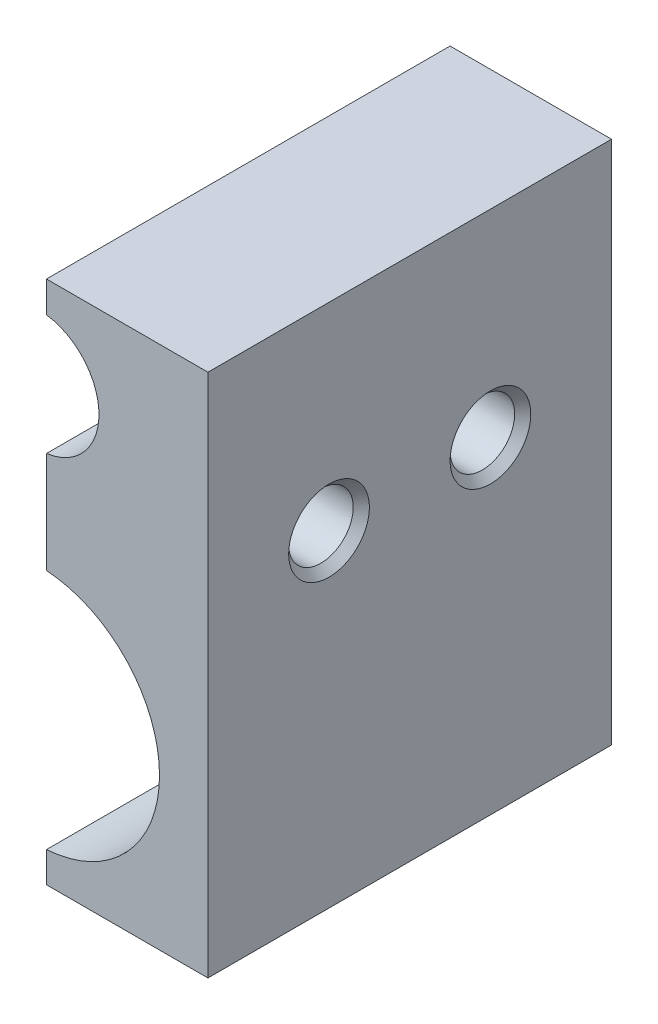
ISO-10303-21;
HEADER;
FILE_DESCRIPTION(('STEP AP214'),'2;1');
FILE_NAME('part.step','',(''),(''),'','','');
FILE_SCHEMA(('AUTOMOTIVE_DESIGN { 1 0 10303 214 1 1 1 1 }'));
ENDSEC;
DATA;
#1=APPLICATION_CONTEXT('core data for automotive mechanical design processes');
#2=APPLICATION_PROTOCOL_DEFINITION('international standard','automotive_design',2000,#1);
#3=PRODUCT_CONTEXT('',#1,'mechanical');
#4=PRODUCT('Part','Part','',(#3));
#5=PRODUCT_RELATED_PRODUCT_CATEGORY('part','',(#4));
#6=PRODUCT_DEFINITION_FORMATION('','',#4);
#7=PRODUCT_DEFINITION_CONTEXT('part definition',#1,'design');
#8=PRODUCT_DEFINITION('design','',#6,#7);
#9=PRODUCT_DEFINITION_SHAPE('','',#8);
#10=(LENGTH_UNIT() NAMED_UNIT(*) SI_UNIT(.MILLI.,.METRE.));
#11=(NAMED_UNIT(*) PLANE_ANGLE_UNIT() SI_UNIT($,.RADIAN.));
#12=(NAMED_UNIT(*) SI_UNIT($,.STERADIAN.) SOLID_ANGLE_UNIT());
#13=UNCERTAINTY_MEASURE_WITH_UNIT(LENGTH_MEASURE(1.E-05),#10,'distance_accuracy_value','');
#14=(GEOMETRIC_REPRESENTATION_CONTEXT(3) GLOBAL_UNCERTAINTY_ASSIGNED_CONTEXT((#13)) GLOBAL_UNIT_ASSIGNED_CONTEXT((#10,
#11,#12)) REPRESENTATION_CONTEXT('',''));
#15=CARTESIAN_POINT('',(0.,0.,0.));
#16=DIRECTION('',(0.,0.,1.));
#17=DIRECTION('',(1.,0.,0.));
#18=AXIS2_PLACEMENT_3D('',#15,#16,#17);
#19=CARTESIAN_POINT('',(-0.999999999999994,18.7498876397339,50.));
#20=DIRECTION('',(0.,0.,-1.));
#21=DIRECTION('',(-1.,0.,0.));
#22=AXIS2_PLACEMENT_3D('',#19,#20,#21);
#23=CYLINDRICAL_SURFACE('',#22,15.);
#24=CARTESIAN_POINT('',(-0.999999999999994,18.7498876397339,0.));
#25=DIRECTION('',(0.,0.,1.));
#26=DIRECTION('',(1.,0.,0.));
#27=AXIS2_PLACEMENT_3D('',#24,#25,#26);
#28=CIRCLE('',#27,15.);
#29=CARTESIAN_POINT('',(0.,3.78325809263809,0.));
#30=VERTEX_POINT('',#29);
#31=CARTESIAN_POINT('',(0.,33.7165171868296,0.));
#32=VERTEX_POINT('',#31);
#33=EDGE_CURVE('E139',#30,#32,#28,.T.);
#34=ORIENTED_EDGE('',*,*,#33,.F.);
#35=DIRECTION('',(0.,0.,-1.));
#36=VECTOR('',#35,1.);
#37=CARTESIAN_POINT('',(0.,3.78325809263809,50.));
#38=LINE('',#37,#36);
#39=CARTESIAN_POINT('',(0.,3.78325809263809,50.));
#40=VERTEX_POINT('',#39);
#41=EDGE_CURVE('E102',#40,#30,#38,.T.);
#42=ORIENTED_EDGE('',*,*,#41,.F.);
#43=CARTESIAN_POINT('',(-0.999999999999994,18.7498876397339,50.));
#44=DIRECTION('',(0.,0.,1.));
#45=DIRECTION('',(1.,0.,0.));
#46=AXIS2_PLACEMENT_3D('',#43,#44,#45);
#47=CIRCLE('',#46,15.);
#48=CARTESIAN_POINT('',(0.,33.7165171868296,50.));
#49=VERTEX_POINT('',#48);
#50=EDGE_CURVE('E157',#40,#49,#47,.T.);
#51=ORIENTED_EDGE('',*,*,#50,.T.);
#52=DIRECTION('',(0.,0.,-1.));
#53=VECTOR('',#52,1.);
#54=CARTESIAN_POINT('',(0.,33.7165171868296,50.));
#55=LINE('',#54,#53);
#56=EDGE_CURVE('E97',#49,#32,#55,.T.);
#57=ORIENTED_EDGE('',*,*,#56,.T.);
#58=EDGE_LOOP('',(#34,#42,#51,#57));
#59=FACE_BOUND('',#58,.T.);
#60=ADVANCED_FACE('F43',(#59),#23,.F.);
#61=CARTESIAN_POINT('',(0.,0.,50.));
#62=DIRECTION('',(1.,0.,0.));
#63=DIRECTION('',(0.,1.,0.));
#64=AXIS2_PLACEMENT_3D('',#61,#62,#63);
#65=PLANE('',#64);
#66=DIRECTION('',(0.,-1.,0.));
#67=VECTOR('',#66,1.);
#68=CARTESIAN_POINT('',(0.,0.,0.));
#69=LINE('',#68,#67);
#70=CARTESIAN_POINT('',(0.,0.,0.));
#71=VERTEX_POINT('',#70);
#72=EDGE_CURVE('E142',#30,#71,#69,.T.);
#73=ORIENTED_EDGE('',*,*,#72,.T.);
#74=DIRECTION('',(0.,0.,-1.));
#75=VECTOR('',#74,1.);
#76=CARTESIAN_POINT('',(0.,0.,50.));
#77=LINE('',#76,#75);
#78=CARTESIAN_POINT('',(0.,0.,50.));
#79=VERTEX_POINT('',#78);
#80=EDGE_CURVE('E166',#79,#71,#77,.T.);
#81=ORIENTED_EDGE('',*,*,#80,.F.);
#82=DIRECTION('',(0.,-1.,0.));
#83=VECTOR('',#82,1.);
#84=CARTESIAN_POINT('',(0.,0.,50.));
#85=LINE('',#84,#83);
#86=EDGE_CURVE('E201',#40,#79,#85,.T.);
#87=ORIENTED_EDGE('',*,*,#86,.F.);
#88=ORIENTED_EDGE('',*,*,#41,.T.);
#89=EDGE_LOOP('',(#73,#81,#87,#88));
#90=FACE_BOUND('',#89,.T.);
#91=ADVANCED_FACE('F220',(#90),#65,.F.);
#92=CARTESIAN_POINT('',(0.,0.,50.));
#93=DIRECTION('',(0.,1.,0.));
#94=DIRECTION('',(0.,0.,1.));
#95=AXIS2_PLACEMENT_3D('',#92,#93,#94);
#96=PLANE('',#95);
#97=DIRECTION('',(1.,0.,0.));
#98=VECTOR('',#97,1.);
#99=CARTESIAN_POINT('',(0.,0.,0.));
#100=LINE('',#99,#98);
#101=CARTESIAN_POINT('',(20.,0.,0.));
#102=VERTEX_POINT('',#101);
#103=EDGE_CURVE('E145',#71,#102,#100,.T.);
#104=ORIENTED_EDGE('',*,*,#103,.T.);
#105=DIRECTION('',(0.,0.,-1.));
#106=VECTOR('',#105,1.);
#107=CARTESIAN_POINT('',(20.,0.,50.));
#108=LINE('',#107,#106);
#109=CARTESIAN_POINT('',(20.,0.,50.));
#110=VERTEX_POINT('',#109);
#111=EDGE_CURVE('E163',#110,#102,#108,.T.);
#112=ORIENTED_EDGE('',*,*,#111,.F.);
#113=DIRECTION('',(1.,0.,0.));
#114=VECTOR('',#113,1.);
#115=CARTESIAN_POINT('',(0.,0.,50.));
#116=LINE('',#115,#114);
#117=EDGE_CURVE('E203',#79,#110,#116,.T.);
#118=ORIENTED_EDGE('',*,*,#117,.F.);
#119=ORIENTED_EDGE('',*,*,#80,.T.);
#120=EDGE_LOOP('',(#104,#112,#118,#119));
#121=FACE_BOUND('',#120,.T.);
#122=ADVANCED_FACE('F223',(#121),#96,.F.);
#123=CARTESIAN_POINT('',(20.,0.,50.));
#124=DIRECTION('',(-1.,0.,0.));
#125=DIRECTION('',(0.,0.,1.));
#126=AXIS2_PLACEMENT_3D('',#123,#124,#125);
#127=PLANE('',#126);
#128=CARTESIAN_POINT('',(20.,40.5051025721682,15.));
#129=DIRECTION('',(-1.,0.,0.));
#130=DIRECTION('',(0.,0.,1.));
#131=AXIS2_PLACEMENT_3D('',#128,#129,#130);
#132=CIRCLE('',#131,5.00000000000004);
#133=CARTESIAN_POINT('',(20.,40.5051025721682,20.));
#134=VERTEX_POINT('',#133);
#135=EDGE_CURVE('E53',#134,#134,#132,.T.);
#136=ORIENTED_EDGE('',*,*,#135,.T.);
#137=EDGE_LOOP('',(#136));
#138=FACE_BOUND('',#137,.T.);
#139=CARTESIAN_POINT('',(20.,40.5051025721682,35.));
#140=DIRECTION('',(-1.,0.,0.));
#141=DIRECTION('',(0.,0.,1.));
#142=AXIS2_PLACEMENT_3D('',#139,#140,#141);
#143=CIRCLE('',#142,5.00000000000005);
#144=CARTESIAN_POINT('',(20.,40.5051025721682,40.0000000000001));
#145=VERTEX_POINT('',#144);
#146=EDGE_CURVE('E173',#145,#145,#143,.T.);
#147=ORIENTED_EDGE('',*,*,#146,.T.);
#148=EDGE_LOOP('',(#147));
#149=FACE_BOUND('',#148,.T.);
#150=DIRECTION('',(0.,1.,0.));
#151=VECTOR('',#150,1.);
#152=CARTESIAN_POINT('',(20.,0.,0.));
#153=LINE('',#152,#151);
#154=CARTESIAN_POINT('',(20.,65.,0.));
#155=VERTEX_POINT('',#154);
#156=EDGE_CURVE('E147',#102,#155,#153,.T.);
#157=ORIENTED_EDGE('',*,*,#156,.T.);
#158=DIRECTION('',(0.,0.,-1.));
#159=VECTOR('',#158,1.);
#160=CARTESIAN_POINT('',(20.,65.,50.));
#161=LINE('',#160,#159);
#162=CARTESIAN_POINT('',(20.,65.,50.));
#163=VERTEX_POINT('',#162);
#164=EDGE_CURVE('E161',#163,#155,#161,.T.);
#165=ORIENTED_EDGE('',*,*,#164,.F.);
#166=DIRECTION('',(0.,1.,0.));
#167=VECTOR('',#166,1.);
#168=CARTESIAN_POINT('',(20.,0.,50.));
#169=LINE('',#168,#167);
#170=EDGE_CURVE('E205',#110,#163,#169,.T.);
#171=ORIENTED_EDGE('',*,*,#170,.F.);
#172=ORIENTED_EDGE('',*,*,#111,.T.);
#173=EDGE_LOOP('',(#157,#165,#171,#172));
#174=FACE_BOUND('',#173,.T.);
#175=ADVANCED_FACE('F178',(#138,#149,#174),#127,.F.);
#176=CARTESIAN_POINT('',(0.,65.,50.));
#177=DIRECTION('',(0.,1.,0.));
#178=DIRECTION('',(0.,0.,1.));
#179=AXIS2_PLACEMENT_3D('',#176,#177,#178);
#180=PLANE('',#179);
#181=DIRECTION('',(1.,0.,0.));
#182=VECTOR('',#181,1.);
#183=CARTESIAN_POINT('',(0.,65.,0.));
#184=LINE('',#183,#182);
#185=CARTESIAN_POINT('',(0.,65.,0.));
#186=VERTEX_POINT('',#185);
#187=EDGE_CURVE('E150',#186,#155,#184,.T.);
#188=ORIENTED_EDGE('',*,*,#187,.F.);
#189=DIRECTION('',(0.,0.,-1.));
#190=VECTOR('',#189,1.);
#191=CARTESIAN_POINT('',(0.,65.,50.));
#192=LINE('',#191,#190);
#193=CARTESIAN_POINT('',(0.,65.,50.));
#194=VERTEX_POINT('',#193);
#195=EDGE_CURVE('E131',#194,#186,#192,.T.);
#196=ORIENTED_EDGE('',*,*,#195,.F.);
#197=DIRECTION('',(1.,0.,0.));
#198=VECTOR('',#197,1.);
#199=CARTESIAN_POINT('',(0.,65.,50.));
#200=LINE('',#199,#198);
#201=EDGE_CURVE('E124',#194,#163,#200,.T.);
#202=ORIENTED_EDGE('',*,*,#201,.T.);
#203=ORIENTED_EDGE('',*,*,#164,.T.);
#204=EDGE_LOOP('',(#188,#196,#202,#203));
#205=FACE_BOUND('',#204,.T.);
#206=ADVANCED_FACE('F208',(#205),#180,.T.);
#207=CARTESIAN_POINT('',(0.,0.,50.));
#208=DIRECTION('',(1.,0.,0.));
#209=DIRECTION('',(0.,1.,0.));
#210=AXIS2_PLACEMENT_3D('',#207,#208,#209);
#211=PLANE('',#210);
#212=DIRECTION('',(0.,-1.,0.));
#213=VECTOR('',#212,1.);
#214=CARTESIAN_POINT('',(0.,0.,0.));
#215=LINE('',#214,#213);
#216=CARTESIAN_POINT('',(0.,61.1495515604889,0.));
#217=VERTEX_POINT('',#216);
#218=EDGE_CURVE('E130',#186,#217,#215,.T.);
#219=ORIENTED_EDGE('',*,*,#218,.T.);
#220=DIRECTION('',(0.,0.,-1.));
#221=VECTOR('',#220,1.);
#222=CARTESIAN_POINT('',(0.,61.1495515604889,50.));
#223=LINE('',#222,#221);
#224=CARTESIAN_POINT('',(0.,61.1495515604889,50.));
#225=VERTEX_POINT('',#224);
#226=EDGE_CURVE('E127',#225,#217,#223,.T.);
#227=ORIENTED_EDGE('',*,*,#226,.F.);
#228=DIRECTION('',(0.,-1.,0.));
#229=VECTOR('',#228,1.);
#230=CARTESIAN_POINT('',(0.,0.,50.));
#231=LINE('',#230,#229);
#232=EDGE_CURVE('E118',#194,#225,#231,.T.);
#233=ORIENTED_EDGE('',*,*,#232,.F.);
#234=ORIENTED_EDGE('',*,*,#195,.T.);
#235=EDGE_LOOP('',(#219,#227,#233,#234));
#236=FACE_BOUND('',#235,.T.);
#237=ADVANCED_FACE('F128',(#236),#211,.F.);
#238=CARTESIAN_POINT('',(-0.999999999999996,53.7165171868296,50.));
#239=DIRECTION('',(0.,0.,-1.));
#240=DIRECTION('',(-1.,0.,0.));
#241=AXIS2_PLACEMENT_3D('',#238,#239,#240);
#242=CYLINDRICAL_SURFACE('',#241,7.5);
#243=CARTESIAN_POINT('',(-0.999999999999996,53.7165171868296,0.));
#244=DIRECTION('',(0.,0.,1.));
#245=DIRECTION('',(1.,0.,0.));
#246=AXIS2_PLACEMENT_3D('',#243,#244,#245);
#247=CIRCLE('',#246,7.5);
#248=CARTESIAN_POINT('',(0.,46.2834828131704,0.));
#249=VERTEX_POINT('',#248);
#250=EDGE_CURVE('E90',#217,#249,#247,.F.);
#251=ORIENTED_EDGE('',*,*,#250,.T.);
#252=DIRECTION('',(0.,0.,-1.));
#253=VECTOR('',#252,1.);
#254=CARTESIAN_POINT('',(0.,46.2834828131704,50.));
#255=LINE('',#254,#253);
#256=CARTESIAN_POINT('',(0.,46.2834828131704,50.));
#257=VERTEX_POINT('',#256);
#258=EDGE_CURVE('E132',#257,#249,#255,.T.);
#259=ORIENTED_EDGE('',*,*,#258,.F.);
#260=CARTESIAN_POINT('',(-0.999999999999996,53.7165171868296,50.));
#261=DIRECTION('',(0.,0.,1.));
#262=DIRECTION('',(1.,0.,0.));
#263=AXIS2_PLACEMENT_3D('',#260,#261,#262);
#264=CIRCLE('',#263,7.5);
#265=EDGE_CURVE('E122',#225,#257,#264,.F.);
#266=ORIENTED_EDGE('',*,*,#265,.F.);
#267=ORIENTED_EDGE('',*,*,#226,.T.);
#268=EDGE_LOOP('',(#251,#259,#266,#267));
#269=FACE_BOUND('',#268,.T.);
#270=ADVANCED_FACE('F134',(#269),#242,.F.);
#271=CARTESIAN_POINT('',(0.,0.,50.));
#272=DIRECTION('',(1.,0.,0.));
#273=DIRECTION('',(0.,1.,0.));
#274=AXIS2_PLACEMENT_3D('',#271,#272,#273);
#275=PLANE('',#274);
#276=CARTESIAN_POINT('',(0.,40.5051025721682,35.));
#277=DIRECTION('',(1.,0.,0.));
#278=DIRECTION('',(0.,1.,0.));
#279=AXIS2_PLACEMENT_3D('',#276,#277,#278);
#280=CIRCLE('',#279,4.00000000000001);
#281=CARTESIAN_POINT('',(0.,44.5051025721682,35.));
#282=VERTEX_POINT('',#281);
#283=EDGE_CURVE('E143',#282,#282,#280,.F.);
#284=ORIENTED_EDGE('',*,*,#283,.F.);
#285=EDGE_LOOP('',(#284));
#286=FACE_BOUND('',#285,.T.);
#287=CARTESIAN_POINT('',(0.,40.5051025721682,15.));
#288=DIRECTION('',(1.,0.,0.));
#289=DIRECTION('',(0.,1.,0.));
#290=AXIS2_PLACEMENT_3D('',#287,#288,#289);
#291=CIRCLE('',#290,4.);
#292=CARTESIAN_POINT('',(0.,44.5051025721682,15.));
#293=VERTEX_POINT('',#292);
#294=EDGE_CURVE('E194',#293,#293,#291,.F.);
#295=ORIENTED_EDGE('',*,*,#294,.F.);
#296=EDGE_LOOP('',(#295));
#297=FACE_BOUND('',#296,.T.);
#298=DIRECTION('',(0.,-1.,0.));
#299=VECTOR('',#298,1.);
#300=CARTESIAN_POINT('',(0.,0.,0.));
#301=LINE('',#300,#299);
#302=EDGE_CURVE('E155',#249,#32,#301,.T.);
#303=ORIENTED_EDGE('',*,*,#302,.T.);
#304=ORIENTED_EDGE('',*,*,#56,.F.);
#305=DIRECTION('',(0.,-1.,0.));
#306=VECTOR('',#305,1.);
#307=CARTESIAN_POINT('',(0.,0.,50.));
#308=LINE('',#307,#306);
#309=EDGE_CURVE('E61',#257,#49,#308,.T.);
#310=ORIENTED_EDGE('',*,*,#309,.F.);
#311=ORIENTED_EDGE('',*,*,#258,.T.);
#312=EDGE_LOOP('',(#303,#304,#310,#311));
#313=FACE_BOUND('',#312,.T.);
#314=ADVANCED_FACE('F215',(#286,#297,#313),#275,.F.);
#315=CARTESIAN_POINT('',(0.,0.,50.));
#316=DIRECTION('',(0.,0.,1.));
#317=DIRECTION('',(1.,0.,0.));
#318=AXIS2_PLACEMENT_3D('',#315,#316,#317);
#319=PLANE('',#318);
#320=ORIENTED_EDGE('',*,*,#50,.F.);
#321=ORIENTED_EDGE('',*,*,#86,.T.);
#322=ORIENTED_EDGE('',*,*,#117,.T.);
#323=ORIENTED_EDGE('',*,*,#170,.T.);
#324=ORIENTED_EDGE('',*,*,#201,.F.);
#325=ORIENTED_EDGE('',*,*,#232,.T.);
#326=ORIENTED_EDGE('',*,*,#265,.T.);
#327=ORIENTED_EDGE('',*,*,#309,.T.);
#328=EDGE_LOOP('',(#320,#321,#322,#323,#324,#325,#326,#327));
#329=FACE_BOUND('',#328,.T.);
#330=ADVANCED_FACE('F120',(#329),#319,.T.);
#331=CARTESIAN_POINT('',(0.,0.,0.));
#332=DIRECTION('',(0.,0.,1.));
#333=DIRECTION('',(1.,0.,0.));
#334=AXIS2_PLACEMENT_3D('',#331,#332,#333);
#335=PLANE('',#334);
#336=ORIENTED_EDGE('',*,*,#33,.T.);
#337=ORIENTED_EDGE('',*,*,#302,.F.);
#338=ORIENTED_EDGE('',*,*,#250,.F.);
#339=ORIENTED_EDGE('',*,*,#218,.F.);
#340=ORIENTED_EDGE('',*,*,#187,.T.);
#341=ORIENTED_EDGE('',*,*,#156,.F.);
#342=ORIENTED_EDGE('',*,*,#103,.F.);
#343=ORIENTED_EDGE('',*,*,#72,.F.);
#344=EDGE_LOOP('',(#336,#337,#338,#339,#340,#341,#342,#343));
#345=FACE_BOUND('',#344,.T.);
#346=ADVANCED_FACE('F190',(#345),#335,.F.);
#347=CARTESIAN_POINT('',(-11.3137084989848,40.5051025721682,15.));
#348=DIRECTION('',(1.,0.,0.));
#349=DIRECTION('',(0.,0.,-1.));
#350=AXIS2_PLACEMENT_3D('',#347,#348,#349);
#351=CYLINDRICAL_SURFACE('',#350,4.);
#352=CARTESIAN_POINT('',(19.,40.5051025721682,15.));
#353=DIRECTION('',(-1.,0.,0.));
#354=DIRECTION('',(0.,0.,1.));
#355=AXIS2_PLACEMENT_3D('',#352,#353,#354);
#356=CIRCLE('',#355,4.);
#357=CARTESIAN_POINT('',(19.,40.5051025721682,19.));
#358=VERTEX_POINT('',#357);
#359=EDGE_CURVE('E170',#358,#358,#356,.F.);
#360=ORIENTED_EDGE('',*,*,#359,.T.);
#361=EDGE_LOOP('',(#360));
#362=FACE_BOUND('',#361,.T.);
#363=ORIENTED_EDGE('',*,*,#294,.T.);
#364=EDGE_LOOP('',(#363));
#365=FACE_BOUND('',#364,.T.);
#366=ADVANCED_FACE('F187',(#362,#365),#351,.F.);
#367=CARTESIAN_POINT('',(-11.3137084989848,40.5051025721682,35.));
#368=DIRECTION('',(1.,0.,0.));
#369=DIRECTION('',(0.,0.,-1.));
#370=AXIS2_PLACEMENT_3D('',#367,#368,#369);
#371=CYLINDRICAL_SURFACE('',#370,4.00000000000001);
#372=CARTESIAN_POINT('',(19.,40.5051025721682,35.));
#373=DIRECTION('',(-1.,0.,0.));
#374=DIRECTION('',(0.,0.,1.));
#375=AXIS2_PLACEMENT_3D('',#372,#373,#374);
#376=CIRCLE('',#375,4.00000000000001);
#377=CARTESIAN_POINT('',(19.,40.5051025721682,39.));
#378=VERTEX_POINT('',#377);
#379=EDGE_CURVE('E11',#378,#378,#376,.F.);
#380=ORIENTED_EDGE('',*,*,#379,.T.);
#381=EDGE_LOOP('',(#380));
#382=FACE_BOUND('',#381,.T.);
#383=ORIENTED_EDGE('',*,*,#283,.T.);
#384=EDGE_LOOP('',(#383));
#385=FACE_BOUND('',#384,.T.);
#386=ADVANCED_FACE('F184',(#382,#385),#371,.F.);
#387=CARTESIAN_POINT('',(19.,40.5051025721682,15.));
#388=DIRECTION('',(1.,0.,0.));
#389=DIRECTION('',(0.,0.,-1.));
#390=AXIS2_PLACEMENT_3D('',#387,#388,#389);
#391=CONICAL_SURFACE('',#390,4.,0.785398163397448);
#392=ORIENTED_EDGE('',*,*,#135,.F.);
#393=EDGE_LOOP('',(#392));
#394=FACE_BOUND('',#393,.T.);
#395=ORIENTED_EDGE('',*,*,#359,.F.);
#396=EDGE_LOOP('',(#395));
#397=FACE_BOUND('',#396,.T.);
#398=ADVANCED_FACE('F181',(#394,#397),#391,.F.);
#399=CARTESIAN_POINT('',(19.,40.5051025721682,35.));
#400=DIRECTION('',(1.,0.,0.));
#401=DIRECTION('',(0.,0.,-1.));
#402=AXIS2_PLACEMENT_3D('',#399,#400,#401);
#403=CONICAL_SURFACE('',#402,4.00000000000001,0.785398163397452);
#404=ORIENTED_EDGE('',*,*,#146,.F.);
#405=EDGE_LOOP('',(#404));
#406=FACE_BOUND('',#405,.T.);
#407=ORIENTED_EDGE('',*,*,#379,.F.);
#408=EDGE_LOOP('',(#407));
#409=FACE_BOUND('',#408,.T.);
#410=ADVANCED_FACE('F46',(#406,#409),#403,.F.);
#411=CLOSED_SHELL('',(#60,#91,#122,#175,#206,#237,#270,#314,#330,#346,#366,#386,#398,#410));
#412=MANIFOLD_SOLID_BREP('B2',#411);
#413=ADVANCED_BREP_SHAPE_REPRESENTATION('',(#18,#412),#14);
#414=SHAPE_DEFINITION_REPRESENTATION(#9,#413);
ENDSEC;
END-ISO-10303-21;
